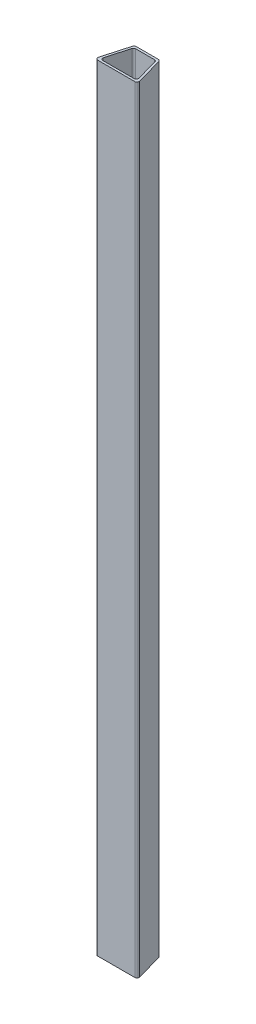
ISO-10303-21;
HEADER;
FILE_DESCRIPTION(('STEP AP214'),'2;1');
FILE_NAME('part.step','',(''),(''),'','','');
FILE_SCHEMA(('AUTOMOTIVE_DESIGN { 1 0 10303 214 1 1 1 1 }'));
ENDSEC;
DATA;
#1=APPLICATION_CONTEXT('core data for automotive mechanical design processes');
#2=APPLICATION_PROTOCOL_DEFINITION('international standard','automotive_design',2000,#1);
#3=PRODUCT_CONTEXT('',#1,'mechanical');
#4=PRODUCT('Part','Part','',(#3));
#5=PRODUCT_RELATED_PRODUCT_CATEGORY('part','',(#4));
#6=PRODUCT_DEFINITION_FORMATION('','',#4);
#7=PRODUCT_DEFINITION_CONTEXT('part definition',#1,'design');
#8=PRODUCT_DEFINITION('design','',#6,#7);
#9=PRODUCT_DEFINITION_SHAPE('','',#8);
#10=(LENGTH_UNIT() NAMED_UNIT(*) SI_UNIT(.MILLI.,.METRE.));
#11=(NAMED_UNIT(*) PLANE_ANGLE_UNIT() SI_UNIT($,.RADIAN.));
#12=(NAMED_UNIT(*) SI_UNIT($,.STERADIAN.) SOLID_ANGLE_UNIT());
#13=UNCERTAINTY_MEASURE_WITH_UNIT(LENGTH_MEASURE(1.E-05),#10,'distance_accuracy_value','');
#14=(GEOMETRIC_REPRESENTATION_CONTEXT(3) GLOBAL_UNCERTAINTY_ASSIGNED_CONTEXT((#13)) GLOBAL_UNIT_ASSIGNED_CONTEXT((#10,
#11,#12)) REPRESENTATION_CONTEXT('',''));
#15=CARTESIAN_POINT('',(0.,0.,0.));
#16=DIRECTION('',(0.,0.,1.));
#17=DIRECTION('',(1.,0.,0.));
#18=AXIS2_PLACEMENT_3D('',#15,#16,#17);
#19=CARTESIAN_POINT('',(-8.35990373267567,350.,6.));
#20=DIRECTION('',(0.,-1.,0.));
#21=DIRECTION('',(0.,0.,-1.));
#22=AXIS2_PLACEMENT_3D('',#19,#20,#21);
#23=PLANE('',#22);
#24=CARTESIAN_POINT('',(-8.35990373267567,350.,6.));
#25=DIRECTION('',(0.,1.,0.));
#26=DIRECTION('',(0.,0.,-1.));
#27=AXIS2_PLACEMENT_3D('',#24,#25,#26);
#28=CIRCLE('',#27,1.);
#29=CARTESIAN_POINT('',(-9.32255467282957,350.,5.72925442308172));
#30=VERTEX_POINT('',#29);
#31=CARTESIAN_POINT('',(-8.35990373267567,350.,7.));
#32=VERTEX_POINT('',#31);
#33=EDGE_CURVE('E214',#30,#32,#28,.T.);
#34=ORIENTED_EDGE('',*,*,#33,.T.);
#35=DIRECTION('',(1.,0.,0.));
#36=VECTOR('',#35,1.);
#37=CARTESIAN_POINT('',(-8.35990373267567,350.,7.));
#38=LINE('',#37,#36);
#39=CARTESIAN_POINT('',(8.35990373267567,350.,7.));
#40=VERTEX_POINT('',#39);
#41=EDGE_CURVE('E216',#32,#40,#38,.T.);
#42=ORIENTED_EDGE('',*,*,#41,.T.);
#43=CARTESIAN_POINT('',(8.35990373267567,350.,6.));
#44=DIRECTION('',(0.,1.,0.));
#45=DIRECTION('',(0.,0.,1.));
#46=AXIS2_PLACEMENT_3D('',#43,#44,#45);
#47=CIRCLE('',#46,1.);
#48=CARTESIAN_POINT('',(9.32255467282956,350.,5.72925442308172));
#49=VERTEX_POINT('',#48);
#50=EDGE_CURVE('E221',#40,#49,#47,.T.);
#51=ORIENTED_EDGE('',*,*,#50,.T.);
#52=DIRECTION('',(-0.270745576918284,0.,-0.962650940153899));
#53=VECTOR('',#52,1.);
#54=CARTESIAN_POINT('',(5.94755467282956,350.,-6.27074557691828));
#55=LINE('',#54,#53);
#56=CARTESIAN_POINT('',(5.94755467282956,350.,-6.27074557691828));
#57=VERTEX_POINT('',#56);
#58=EDGE_CURVE('E223',#49,#57,#55,.T.);
#59=ORIENTED_EDGE('',*,*,#58,.T.);
#60=CARTESIAN_POINT('',(4.98490373267567,350.,-6.));
#61=DIRECTION('',(0.,1.,0.));
#62=DIRECTION('',(0.,0.,-1.));
#63=AXIS2_PLACEMENT_3D('',#60,#61,#62);
#64=CIRCLE('',#63,0.999999999999998);
#65=CARTESIAN_POINT('',(4.98490373267567,350.,-7.));
#66=VERTEX_POINT('',#65);
#67=EDGE_CURVE('E224',#57,#66,#64,.T.);
#68=ORIENTED_EDGE('',*,*,#67,.T.);
#69=DIRECTION('',(-1.,0.,0.));
#70=VECTOR('',#69,1.);
#71=CARTESIAN_POINT('',(-4.98490373267567,350.,-7.));
#72=LINE('',#71,#70);
#73=CARTESIAN_POINT('',(-4.98490373267567,350.,-7.));
#74=VERTEX_POINT('',#73);
#75=EDGE_CURVE('E230',#66,#74,#72,.T.);
#76=ORIENTED_EDGE('',*,*,#75,.T.);
#77=CARTESIAN_POINT('',(-4.98490373267567,350.,-6.));
#78=DIRECTION('',(0.,1.,0.));
#79=DIRECTION('',(0.,0.,1.));
#80=AXIS2_PLACEMENT_3D('',#77,#78,#79);
#81=CIRCLE('',#80,0.999999999999999);
#82=CARTESIAN_POINT('',(-5.94755467282956,350.,-6.27074557691828));
#83=VERTEX_POINT('',#82);
#84=EDGE_CURVE('E227',#74,#83,#81,.T.);
#85=ORIENTED_EDGE('',*,*,#84,.T.);
#86=DIRECTION('',(-0.270745576918284,0.,0.962650940153899));
#87=VECTOR('',#86,1.);
#88=CARTESIAN_POINT('',(-5.94755467282956,350.,-6.27074557691828));
#89=LINE('',#88,#87);
#90=EDGE_CURVE('E231',#83,#30,#89,.T.);
#91=ORIENTED_EDGE('',*,*,#90,.T.);
#92=EDGE_LOOP('',(#34,#42,#51,#59,#68,#76,#85,#91));
#93=FACE_BOUND('',#92,.T.);
#94=CARTESIAN_POINT('',(-7.0398555990135,350.,5.));
#95=DIRECTION('',(0.,1.,0.));
#96=DIRECTION('',(0.,0.,1.));
#97=AXIS2_PLACEMENT_3D('',#94,#95,#96);
#98=CIRCLE('',#97,1.);
#99=CARTESIAN_POINT('',(-8.0025065391674,350.,4.72925442308171));
#100=VERTEX_POINT('',#99);
#101=CARTESIAN_POINT('',(-7.03985559901349,350.,6.));
#102=VERTEX_POINT('',#101);
#103=EDGE_CURVE('E148',#100,#102,#98,.T.);
#104=ORIENTED_EDGE('',*,*,#103,.F.);
#105=DIRECTION('',(-0.270745576918284,0.,0.962650940153899));
#106=VECTOR('',#105,1.);
#107=CARTESIAN_POINT('',(-5.1900065391674,350.,-5.27074557691828));
#108=LINE('',#107,#106);
#109=CARTESIAN_POINT('',(-5.1900065391674,350.,-5.27074557691828));
#110=VERTEX_POINT('',#109);
#111=EDGE_CURVE('E183',#110,#100,#108,.T.);
#112=ORIENTED_EDGE('',*,*,#111,.F.);
#113=CARTESIAN_POINT('',(-4.2273555990135,350.,-5.));
#114=DIRECTION('',(0.,1.,0.));
#115=DIRECTION('',(0.,0.,1.));
#116=AXIS2_PLACEMENT_3D('',#113,#114,#115);
#117=CIRCLE('',#116,1.);
#118=CARTESIAN_POINT('',(-4.22735559901349,350.,-6.));
#119=VERTEX_POINT('',#118);
#120=EDGE_CURVE('E181',#119,#110,#117,.T.);
#121=ORIENTED_EDGE('',*,*,#120,.F.);
#122=DIRECTION('',(-1.,0.,0.));
#123=VECTOR('',#122,1.);
#124=CARTESIAN_POINT('',(-4.22735559901349,350.,-6.));
#125=LINE('',#124,#123);
#126=CARTESIAN_POINT('',(4.22735559901349,350.,-6.));
#127=VERTEX_POINT('',#126);
#128=EDGE_CURVE('E177',#127,#119,#125,.T.);
#129=ORIENTED_EDGE('',*,*,#128,.F.);
#130=CARTESIAN_POINT('',(4.2273555990135,350.,-5.));
#131=DIRECTION('',(0.,1.,0.));
#132=DIRECTION('',(0.,0.,1.));
#133=AXIS2_PLACEMENT_3D('',#130,#131,#132);
#134=CIRCLE('',#133,1.);
#135=CARTESIAN_POINT('',(5.1900065391674,350.,-5.27074557691828));
#136=VERTEX_POINT('',#135);
#137=EDGE_CURVE('E180',#136,#127,#134,.T.);
#138=ORIENTED_EDGE('',*,*,#137,.F.);
#139=DIRECTION('',(-0.270745576918284,0.,-0.962650940153899));
#140=VECTOR('',#139,1.);
#141=CARTESIAN_POINT('',(5.1900065391674,350.,-5.27074557691828));
#142=LINE('',#141,#140);
#143=CARTESIAN_POINT('',(8.0025065391674,350.,4.72925442308171));
#144=VERTEX_POINT('',#143);
#145=EDGE_CURVE('E171',#144,#136,#142,.T.);
#146=ORIENTED_EDGE('',*,*,#145,.F.);
#147=CARTESIAN_POINT('',(7.0398555990135,350.,5.));
#148=DIRECTION('',(0.,1.,0.));
#149=DIRECTION('',(0.,0.,-1.));
#150=AXIS2_PLACEMENT_3D('',#147,#148,#149);
#151=CIRCLE('',#150,1.);
#152=CARTESIAN_POINT('',(7.03985559901349,350.,6.));
#153=VERTEX_POINT('',#152);
#154=EDGE_CURVE('E173',#153,#144,#151,.T.);
#155=ORIENTED_EDGE('',*,*,#154,.F.);
#156=DIRECTION('',(1.,0.,0.));
#157=VECTOR('',#156,1.);
#158=CARTESIAN_POINT('',(-7.03985559901349,350.,6.));
#159=LINE('',#158,#157);
#160=EDGE_CURVE('E156',#102,#153,#159,.T.);
#161=ORIENTED_EDGE('',*,*,#160,.F.);
#162=EDGE_LOOP('',(#104,#112,#121,#129,#138,#146,#155,#161));
#163=FACE_BOUND('',#162,.T.);
#164=ADVANCED_FACE('F40',(#93,#163),#23,.F.);
#165=CARTESIAN_POINT('',(-8.35990373267567,0.,6.));
#166=DIRECTION('',(0.,-1.,0.));
#167=DIRECTION('',(0.,0.,-1.));
#168=AXIS2_PLACEMENT_3D('',#165,#166,#167);
#169=PLANE('',#168);
#170=CARTESIAN_POINT('',(-8.35990373267567,0.,6.));
#171=DIRECTION('',(0.,1.,0.));
#172=DIRECTION('',(0.,0.,-1.));
#173=AXIS2_PLACEMENT_3D('',#170,#171,#172);
#174=CIRCLE('',#173,1.);
#175=CARTESIAN_POINT('',(-9.32255467282957,0.,5.72925442308172));
#176=VERTEX_POINT('',#175);
#177=CARTESIAN_POINT('',(-8.35990373267567,0.,7.));
#178=VERTEX_POINT('',#177);
#179=EDGE_CURVE('E168',#176,#178,#174,.T.);
#180=ORIENTED_EDGE('',*,*,#179,.F.);
#181=DIRECTION('',(-0.270745576918284,0.,0.962650940153899));
#182=VECTOR('',#181,1.);
#183=CARTESIAN_POINT('',(-5.94755467282956,0.,-6.27074557691828));
#184=LINE('',#183,#182);
#185=CARTESIAN_POINT('',(-5.94755467282956,0.,-6.27074557691828));
#186=VERTEX_POINT('',#185);
#187=EDGE_CURVE('E219',#186,#176,#184,.T.);
#188=ORIENTED_EDGE('',*,*,#187,.F.);
#189=CARTESIAN_POINT('',(-4.98490373267567,0.,-6.));
#190=DIRECTION('',(0.,1.,0.));
#191=DIRECTION('',(0.,0.,1.));
#192=AXIS2_PLACEMENT_3D('',#189,#190,#191);
#193=CIRCLE('',#192,0.999999999999999);
#194=CARTESIAN_POINT('',(-4.98490373267567,0.,-7.));
#195=VERTEX_POINT('',#194);
#196=EDGE_CURVE('E247',#195,#186,#193,.T.);
#197=ORIENTED_EDGE('',*,*,#196,.F.);
#198=DIRECTION('',(-1.,0.,0.));
#199=VECTOR('',#198,1.);
#200=CARTESIAN_POINT('',(-4.98490373267567,0.,-7.));
#201=LINE('',#200,#199);
#202=CARTESIAN_POINT('',(4.98490373267567,0.,-7.));
#203=VERTEX_POINT('',#202);
#204=EDGE_CURVE('E242',#203,#195,#201,.T.);
#205=ORIENTED_EDGE('',*,*,#204,.F.);
#206=CARTESIAN_POINT('',(4.98490373267567,0.,-6.));
#207=DIRECTION('',(0.,1.,0.));
#208=DIRECTION('',(0.,0.,-1.));
#209=AXIS2_PLACEMENT_3D('',#206,#207,#208);
#210=CIRCLE('',#209,0.999999999999998);
#211=CARTESIAN_POINT('',(5.94755467282956,0.,-6.27074557691828));
#212=VERTEX_POINT('',#211);
#213=EDGE_CURVE('E245',#212,#203,#210,.T.);
#214=ORIENTED_EDGE('',*,*,#213,.F.);
#215=DIRECTION('',(-0.270745576918284,0.,-0.962650940153899));
#216=VECTOR('',#215,1.);
#217=CARTESIAN_POINT('',(5.94755467282956,0.,-6.27074557691828));
#218=LINE('',#217,#216);
#219=CARTESIAN_POINT('',(9.32255467282956,0.,5.72925442308172));
#220=VERTEX_POINT('',#219);
#221=EDGE_CURVE('E238',#220,#212,#218,.T.);
#222=ORIENTED_EDGE('',*,*,#221,.F.);
#223=CARTESIAN_POINT('',(8.35990373267567,0.,6.));
#224=DIRECTION('',(0.,1.,0.));
#225=DIRECTION('',(0.,0.,1.));
#226=AXIS2_PLACEMENT_3D('',#223,#224,#225);
#227=CIRCLE('',#226,1.);
#228=CARTESIAN_POINT('',(8.35990373267567,0.,7.));
#229=VERTEX_POINT('',#228);
#230=EDGE_CURVE('E239',#229,#220,#227,.T.);
#231=ORIENTED_EDGE('',*,*,#230,.F.);
#232=DIRECTION('',(1.,0.,0.));
#233=VECTOR('',#232,1.);
#234=CARTESIAN_POINT('',(-8.35990373267567,0.,7.));
#235=LINE('',#234,#233);
#236=EDGE_CURVE('E237',#178,#229,#235,.T.);
#237=ORIENTED_EDGE('',*,*,#236,.F.);
#238=EDGE_LOOP('',(#180,#188,#197,#205,#214,#222,#231,#237));
#239=FACE_BOUND('',#238,.T.);
#240=DIRECTION('',(-0.270745576918284,0.,0.962650940153899));
#241=VECTOR('',#240,1.);
#242=CARTESIAN_POINT('',(-5.1900065391674,0.,-5.27074557691828));
#243=LINE('',#242,#241);
#244=CARTESIAN_POINT('',(-5.1900065391674,0.,-5.27074557691828));
#245=VERTEX_POINT('',#244);
#246=CARTESIAN_POINT('',(-8.0025065391674,0.,4.72925442308171));
#247=VERTEX_POINT('',#246);
#248=EDGE_CURVE('E159',#245,#247,#243,.T.);
#249=ORIENTED_EDGE('',*,*,#248,.T.);
#250=CARTESIAN_POINT('',(-7.0398555990135,0.,5.));
#251=DIRECTION('',(0.,1.,0.));
#252=DIRECTION('',(0.,0.,1.));
#253=AXIS2_PLACEMENT_3D('',#250,#251,#252);
#254=CIRCLE('',#253,1.);
#255=CARTESIAN_POINT('',(-7.03985559901349,0.,6.));
#256=VERTEX_POINT('',#255);
#257=EDGE_CURVE('E58',#247,#256,#254,.T.);
#258=ORIENTED_EDGE('',*,*,#257,.T.);
#259=DIRECTION('',(1.,0.,0.));
#260=VECTOR('',#259,1.);
#261=CARTESIAN_POINT('',(-7.03985559901349,0.,6.));
#262=LINE('',#261,#260);
#263=CARTESIAN_POINT('',(7.03985559901349,0.,6.));
#264=VERTEX_POINT('',#263);
#265=EDGE_CURVE('E164',#256,#264,#262,.T.);
#266=ORIENTED_EDGE('',*,*,#265,.T.);
#267=CARTESIAN_POINT('',(7.0398555990135,0.,5.));
#268=DIRECTION('',(0.,1.,0.));
#269=DIRECTION('',(0.,0.,-1.));
#270=AXIS2_PLACEMENT_3D('',#267,#268,#269);
#271=CIRCLE('',#270,1.);
#272=CARTESIAN_POINT('',(8.0025065391674,0.,4.72925442308171));
#273=VERTEX_POINT('',#272);
#274=EDGE_CURVE('E190',#264,#273,#271,.T.);
#275=ORIENTED_EDGE('',*,*,#274,.T.);
#276=DIRECTION('',(-0.270745576918284,0.,-0.962650940153899));
#277=VECTOR('',#276,1.);
#278=CARTESIAN_POINT('',(5.1900065391674,0.,-5.27074557691828));
#279=LINE('',#278,#277);
#280=CARTESIAN_POINT('',(5.1900065391674,0.,-5.27074557691828));
#281=VERTEX_POINT('',#280);
#282=EDGE_CURVE('E189',#273,#281,#279,.T.);
#283=ORIENTED_EDGE('',*,*,#282,.T.);
#284=CARTESIAN_POINT('',(4.2273555990135,0.,-5.));
#285=DIRECTION('',(0.,1.,0.));
#286=DIRECTION('',(0.,0.,1.));
#287=AXIS2_PLACEMENT_3D('',#284,#285,#286);
#288=CIRCLE('',#287,1.);
#289=CARTESIAN_POINT('',(4.22735559901349,0.,-6.));
#290=VERTEX_POINT('',#289);
#291=EDGE_CURVE('E194',#281,#290,#288,.T.);
#292=ORIENTED_EDGE('',*,*,#291,.T.);
#293=DIRECTION('',(-1.,0.,0.));
#294=VECTOR('',#293,1.);
#295=CARTESIAN_POINT('',(-4.22735559901349,0.,-6.));
#296=LINE('',#295,#294);
#297=CARTESIAN_POINT('',(-4.22735559901349,0.,-6.));
#298=VERTEX_POINT('',#297);
#299=EDGE_CURVE('E198',#290,#298,#296,.T.);
#300=ORIENTED_EDGE('',*,*,#299,.T.);
#301=CARTESIAN_POINT('',(-4.2273555990135,0.,-5.));
#302=DIRECTION('',(0.,1.,0.));
#303=DIRECTION('',(0.,0.,1.));
#304=AXIS2_PLACEMENT_3D('',#301,#302,#303);
#305=CIRCLE('',#304,1.);
#306=EDGE_CURVE('E197',#298,#245,#305,.T.);
#307=ORIENTED_EDGE('',*,*,#306,.T.);
#308=EDGE_LOOP('',(#249,#258,#266,#275,#283,#292,#300,#307));
#309=FACE_BOUND('',#308,.T.);
#310=ADVANCED_FACE('F276',(#239,#309),#169,.T.);
#311=CARTESIAN_POINT('',(-8.35990373267567,350.,6.));
#312=DIRECTION('',(0.,-1.,0.));
#313=DIRECTION('',(0.,0.,-1.));
#314=AXIS2_PLACEMENT_3D('',#311,#312,#313);
#315=CYLINDRICAL_SURFACE('',#314,1.);
#316=ORIENTED_EDGE('',*,*,#179,.T.);
#317=DIRECTION('',(0.,-1.,0.));
#318=VECTOR('',#317,1.);
#319=CARTESIAN_POINT('',(-8.35990373267567,350.,7.));
#320=LINE('',#319,#318);
#321=EDGE_CURVE('E11',#32,#178,#320,.T.);
#322=ORIENTED_EDGE('',*,*,#321,.F.);
#323=ORIENTED_EDGE('',*,*,#33,.F.);
#324=DIRECTION('',(0.,-1.,0.));
#325=VECTOR('',#324,1.);
#326=CARTESIAN_POINT('',(-9.32255467282957,350.,5.72925442308172));
#327=LINE('',#326,#325);
#328=EDGE_CURVE('E232',#30,#176,#327,.T.);
#329=ORIENTED_EDGE('',*,*,#328,.T.);
#330=EDGE_LOOP('',(#316,#322,#323,#329));
#331=FACE_BOUND('',#330,.T.);
#332=ADVANCED_FACE('F39',(#331),#315,.T.);
#333=CARTESIAN_POINT('',(-8.35990373267567,350.,7.));
#334=DIRECTION('',(0.,0.,-1.));
#335=DIRECTION('',(-1.,0.,0.));
#336=AXIS2_PLACEMENT_3D('',#333,#334,#335);
#337=PLANE('',#336);
#338=ORIENTED_EDGE('',*,*,#236,.T.);
#339=DIRECTION('',(0.,-1.,0.));
#340=VECTOR('',#339,1.);
#341=CARTESIAN_POINT('',(8.35990373267567,350.,7.));
#342=LINE('',#341,#340);
#343=EDGE_CURVE('E44',#40,#229,#342,.T.);
#344=ORIENTED_EDGE('',*,*,#343,.F.);
#345=ORIENTED_EDGE('',*,*,#41,.F.);
#346=ORIENTED_EDGE('',*,*,#321,.T.);
#347=EDGE_LOOP('',(#338,#344,#345,#346));
#348=FACE_BOUND('',#347,.T.);
#349=ADVANCED_FACE('F291',(#348),#337,.F.);
#350=CARTESIAN_POINT('',(8.35990373267567,350.,6.));
#351=DIRECTION('',(0.,-1.,0.));
#352=DIRECTION('',(0.,0.,-1.));
#353=AXIS2_PLACEMENT_3D('',#350,#351,#352);
#354=CYLINDRICAL_SURFACE('',#353,1.);
#355=ORIENTED_EDGE('',*,*,#230,.T.);
#356=DIRECTION('',(0.,-1.,0.));
#357=VECTOR('',#356,1.);
#358=CARTESIAN_POINT('',(9.32255467282956,350.,5.72925442308172));
#359=LINE('',#358,#357);
#360=EDGE_CURVE('E261',#49,#220,#359,.T.);
#361=ORIENTED_EDGE('',*,*,#360,.F.);
#362=ORIENTED_EDGE('',*,*,#50,.F.);
#363=ORIENTED_EDGE('',*,*,#343,.T.);
#364=EDGE_LOOP('',(#355,#361,#362,#363));
#365=FACE_BOUND('',#364,.T.);
#366=ADVANCED_FACE('F269',(#365),#354,.T.);
#367=CARTESIAN_POINT('',(5.94755467282956,350.,-6.27074557691828));
#368=DIRECTION('',(-0.962650940153899,0.,0.270745576918284));
#369=DIRECTION('',(0.270745576918284,0.,0.962650940153899));
#370=AXIS2_PLACEMENT_3D('',#367,#368,#369);
#371=PLANE('',#370);
#372=ORIENTED_EDGE('',*,*,#221,.T.);
#373=DIRECTION('',(0.,-1.,0.));
#374=VECTOR('',#373,1.);
#375=CARTESIAN_POINT('',(5.94755467282956,350.,-6.27074557691828));
#376=LINE('',#375,#374);
#377=EDGE_CURVE('E259',#57,#212,#376,.T.);
#378=ORIENTED_EDGE('',*,*,#377,.F.);
#379=ORIENTED_EDGE('',*,*,#58,.F.);
#380=ORIENTED_EDGE('',*,*,#360,.T.);
#381=EDGE_LOOP('',(#372,#378,#379,#380));
#382=FACE_BOUND('',#381,.T.);
#383=ADVANCED_FACE('F285',(#382),#371,.F.);
#384=CARTESIAN_POINT('',(4.98490373267567,350.,-6.));
#385=DIRECTION('',(0.,-1.,0.));
#386=DIRECTION('',(0.,0.,-1.));
#387=AXIS2_PLACEMENT_3D('',#384,#385,#386);
#388=CYLINDRICAL_SURFACE('',#387,0.999999999999998);
#389=ORIENTED_EDGE('',*,*,#213,.T.);
#390=DIRECTION('',(0.,-1.,0.));
#391=VECTOR('',#390,1.);
#392=CARTESIAN_POINT('',(4.98490373267567,350.,-7.));
#393=LINE('',#392,#391);
#394=EDGE_CURVE('E257',#66,#203,#393,.T.);
#395=ORIENTED_EDGE('',*,*,#394,.F.);
#396=ORIENTED_EDGE('',*,*,#67,.F.);
#397=ORIENTED_EDGE('',*,*,#377,.T.);
#398=EDGE_LOOP('',(#389,#395,#396,#397));
#399=FACE_BOUND('',#398,.T.);
#400=ADVANCED_FACE('F288',(#399),#388,.T.);
#401=CARTESIAN_POINT('',(-4.98490373267567,350.,-7.));
#402=DIRECTION('',(0.,0.,1.));
#403=DIRECTION('',(1.,0.,0.));
#404=AXIS2_PLACEMENT_3D('',#401,#402,#403);
#405=PLANE('',#404);
#406=ORIENTED_EDGE('',*,*,#204,.T.);
#407=DIRECTION('',(0.,-1.,0.));
#408=VECTOR('',#407,1.);
#409=CARTESIAN_POINT('',(-4.98490373267567,350.,-7.));
#410=LINE('',#409,#408);
#411=EDGE_CURVE('E252',#74,#195,#410,.T.);
#412=ORIENTED_EDGE('',*,*,#411,.F.);
#413=ORIENTED_EDGE('',*,*,#75,.F.);
#414=ORIENTED_EDGE('',*,*,#394,.T.);
#415=EDGE_LOOP('',(#406,#412,#413,#414));
#416=FACE_BOUND('',#415,.T.);
#417=ADVANCED_FACE('F308',(#416),#405,.F.);
#418=CARTESIAN_POINT('',(-4.98490373267567,350.,-6.));
#419=DIRECTION('',(0.,-1.,0.));
#420=DIRECTION('',(0.,0.,-1.));
#421=AXIS2_PLACEMENT_3D('',#418,#419,#420);
#422=CYLINDRICAL_SURFACE('',#421,0.999999999999999);
#423=ORIENTED_EDGE('',*,*,#196,.T.);
#424=DIRECTION('',(0.,-1.,0.));
#425=VECTOR('',#424,1.);
#426=CARTESIAN_POINT('',(-5.94755467282956,350.,-6.27074557691828));
#427=LINE('',#426,#425);
#428=EDGE_CURVE('E253',#83,#186,#427,.T.);
#429=ORIENTED_EDGE('',*,*,#428,.F.);
#430=ORIENTED_EDGE('',*,*,#84,.F.);
#431=ORIENTED_EDGE('',*,*,#411,.T.);
#432=EDGE_LOOP('',(#423,#429,#430,#431));
#433=FACE_BOUND('',#432,.T.);
#434=ADVANCED_FACE('F305',(#433),#422,.T.);
#435=CARTESIAN_POINT('',(-5.94755467282956,350.,-6.27074557691828));
#436=DIRECTION('',(0.962650940153899,0.,0.270745576918284));
#437=DIRECTION('',(0.270745576918284,0.,-0.962650940153899));
#438=AXIS2_PLACEMENT_3D('',#435,#436,#437);
#439=PLANE('',#438);
#440=ORIENTED_EDGE('',*,*,#187,.T.);
#441=ORIENTED_EDGE('',*,*,#328,.F.);
#442=ORIENTED_EDGE('',*,*,#90,.F.);
#443=ORIENTED_EDGE('',*,*,#428,.T.);
#444=EDGE_LOOP('',(#440,#441,#442,#443));
#445=FACE_BOUND('',#444,.T.);
#446=ADVANCED_FACE('F297',(#445),#439,.F.);
#447=CARTESIAN_POINT('',(-7.0398555990135,350.,5.));
#448=DIRECTION('',(0.,-1.,0.));
#449=DIRECTION('',(0.,0.,-1.));
#450=AXIS2_PLACEMENT_3D('',#447,#448,#449);
#451=CYLINDRICAL_SURFACE('',#450,1.);
#452=ORIENTED_EDGE('',*,*,#257,.F.);
#453=DIRECTION('',(0.,-1.,0.));
#454=VECTOR('',#453,1.);
#455=CARTESIAN_POINT('',(-8.0025065391674,350.,4.72925442308171));
#456=LINE('',#455,#454);
#457=EDGE_CURVE('E152',#100,#247,#456,.T.);
#458=ORIENTED_EDGE('',*,*,#457,.F.);
#459=ORIENTED_EDGE('',*,*,#103,.T.);
#460=DIRECTION('',(0.,-1.,0.));
#461=VECTOR('',#460,1.);
#462=CARTESIAN_POINT('',(-7.03985559901349,350.,6.));
#463=LINE('',#462,#461);
#464=EDGE_CURVE('E151',#102,#256,#463,.T.);
#465=ORIENTED_EDGE('',*,*,#464,.T.);
#466=EDGE_LOOP('',(#452,#458,#459,#465));
#467=FACE_BOUND('',#466,.T.);
#468=ADVANCED_FACE('F155',(#467),#451,.F.);
#469=CARTESIAN_POINT('',(-7.03985559901349,350.,6.));
#470=DIRECTION('',(0.,0.,-1.));
#471=DIRECTION('',(-1.,0.,0.));
#472=AXIS2_PLACEMENT_3D('',#469,#470,#471);
#473=PLANE('',#472);
#474=ORIENTED_EDGE('',*,*,#265,.F.);
#475=ORIENTED_EDGE('',*,*,#464,.F.);
#476=ORIENTED_EDGE('',*,*,#160,.T.);
#477=DIRECTION('',(0.,-1.,0.));
#478=VECTOR('',#477,1.);
#479=CARTESIAN_POINT('',(7.03985559901349,350.,6.));
#480=LINE('',#479,#478);
#481=EDGE_CURVE('E167',#153,#264,#480,.T.);
#482=ORIENTED_EDGE('',*,*,#481,.T.);
#483=EDGE_LOOP('',(#474,#475,#476,#482));
#484=FACE_BOUND('',#483,.T.);
#485=ADVANCED_FACE('F165',(#484),#473,.T.);
#486=CARTESIAN_POINT('',(7.0398555990135,350.,5.));
#487=DIRECTION('',(0.,-1.,0.));
#488=DIRECTION('',(0.,0.,-1.));
#489=AXIS2_PLACEMENT_3D('',#486,#487,#488);
#490=CYLINDRICAL_SURFACE('',#489,1.);
#491=ORIENTED_EDGE('',*,*,#274,.F.);
#492=ORIENTED_EDGE('',*,*,#481,.F.);
#493=ORIENTED_EDGE('',*,*,#154,.T.);
#494=DIRECTION('',(0.,-1.,0.));
#495=VECTOR('',#494,1.);
#496=CARTESIAN_POINT('',(8.0025065391674,350.,4.72925442308171));
#497=LINE('',#496,#495);
#498=EDGE_CURVE('E212',#144,#273,#497,.T.);
#499=ORIENTED_EDGE('',*,*,#498,.T.);
#500=EDGE_LOOP('',(#491,#492,#493,#499));
#501=FACE_BOUND('',#500,.T.);
#502=ADVANCED_FACE('F333',(#501),#490,.F.);
#503=CARTESIAN_POINT('',(5.1900065391674,350.,-5.27074557691828));
#504=DIRECTION('',(-0.962650940153899,0.,0.270745576918284));
#505=DIRECTION('',(0.270745576918284,0.,0.962650940153899));
#506=AXIS2_PLACEMENT_3D('',#503,#504,#505);
#507=PLANE('',#506);
#508=ORIENTED_EDGE('',*,*,#282,.F.);
#509=ORIENTED_EDGE('',*,*,#498,.F.);
#510=ORIENTED_EDGE('',*,*,#145,.T.);
#511=DIRECTION('',(0.,-1.,0.));
#512=VECTOR('',#511,1.);
#513=CARTESIAN_POINT('',(5.1900065391674,350.,-5.27074557691828));
#514=LINE('',#513,#512);
#515=EDGE_CURVE('E209',#136,#281,#514,.T.);
#516=ORIENTED_EDGE('',*,*,#515,.T.);
#517=EDGE_LOOP('',(#508,#509,#510,#516));
#518=FACE_BOUND('',#517,.T.);
#519=ADVANCED_FACE('F334',(#518),#507,.T.);
#520=CARTESIAN_POINT('',(4.2273555990135,350.,-5.));
#521=DIRECTION('',(0.,-1.,0.));
#522=DIRECTION('',(0.,0.,-1.));
#523=AXIS2_PLACEMENT_3D('',#520,#521,#522);
#524=CYLINDRICAL_SURFACE('',#523,1.);
#525=ORIENTED_EDGE('',*,*,#291,.F.);
#526=ORIENTED_EDGE('',*,*,#515,.F.);
#527=ORIENTED_EDGE('',*,*,#137,.T.);
#528=DIRECTION('',(0.,-1.,0.));
#529=VECTOR('',#528,1.);
#530=CARTESIAN_POINT('',(4.22735559901349,350.,-6.));
#531=LINE('',#530,#529);
#532=EDGE_CURVE('E206',#127,#290,#531,.T.);
#533=ORIENTED_EDGE('',*,*,#532,.T.);
#534=EDGE_LOOP('',(#525,#526,#527,#533));
#535=FACE_BOUND('',#534,.T.);
#536=ADVANCED_FACE('F343',(#535),#524,.F.);
#537=CARTESIAN_POINT('',(-4.22735559901349,350.,-6.));
#538=DIRECTION('',(0.,0.,1.));
#539=DIRECTION('',(1.,0.,0.));
#540=AXIS2_PLACEMENT_3D('',#537,#538,#539);
#541=PLANE('',#540);
#542=ORIENTED_EDGE('',*,*,#299,.F.);
#543=ORIENTED_EDGE('',*,*,#532,.F.);
#544=ORIENTED_EDGE('',*,*,#128,.T.);
#545=DIRECTION('',(0.,-1.,0.));
#546=VECTOR('',#545,1.);
#547=CARTESIAN_POINT('',(-4.22735559901349,350.,-6.));
#548=LINE('',#547,#546);
#549=EDGE_CURVE('E208',#119,#298,#548,.T.);
#550=ORIENTED_EDGE('',*,*,#549,.T.);
#551=EDGE_LOOP('',(#542,#543,#544,#550));
#552=FACE_BOUND('',#551,.T.);
#553=ADVANCED_FACE('F344',(#552),#541,.T.);
#554=CARTESIAN_POINT('',(-4.2273555990135,350.,-5.));
#555=DIRECTION('',(0.,-1.,0.));
#556=DIRECTION('',(0.,0.,-1.));
#557=AXIS2_PLACEMENT_3D('',#554,#555,#556);
#558=CYLINDRICAL_SURFACE('',#557,1.);
#559=ORIENTED_EDGE('',*,*,#306,.F.);
#560=ORIENTED_EDGE('',*,*,#549,.F.);
#561=ORIENTED_EDGE('',*,*,#120,.T.);
#562=DIRECTION('',(0.,-1.,0.));
#563=VECTOR('',#562,1.);
#564=CARTESIAN_POINT('',(-5.1900065391674,350.,-5.27074557691828));
#565=LINE('',#564,#563);
#566=EDGE_CURVE('E55',#110,#245,#565,.T.);
#567=ORIENTED_EDGE('',*,*,#566,.T.);
#568=EDGE_LOOP('',(#559,#560,#561,#567));
#569=FACE_BOUND('',#568,.T.);
#570=ADVANCED_FACE('F350',(#569),#558,.F.);
#571=CARTESIAN_POINT('',(-5.1900065391674,350.,-5.27074557691828));
#572=DIRECTION('',(0.962650940153899,0.,0.270745576918284));
#573=DIRECTION('',(0.270745576918284,0.,-0.962650940153899));
#574=AXIS2_PLACEMENT_3D('',#571,#572,#573);
#575=PLANE('',#574);
#576=ORIENTED_EDGE('',*,*,#248,.F.);
#577=ORIENTED_EDGE('',*,*,#566,.F.);
#578=ORIENTED_EDGE('',*,*,#111,.T.);
#579=ORIENTED_EDGE('',*,*,#457,.T.);
#580=EDGE_LOOP('',(#576,#577,#578,#579));
#581=FACE_BOUND('',#580,.T.);
#582=ADVANCED_FACE('F351',(#581),#575,.T.);
#583=CLOSED_SHELL('',(#164,#310,#332,#349,#366,#383,#400,#417,#434,#446,#468,#485,#502,#519,
#536,#553,#570,#582));
#584=MANIFOLD_SOLID_BREP('B2',#583);
#585=ADVANCED_BREP_SHAPE_REPRESENTATION('',(#18,#584),#14);
#586=SHAPE_DEFINITION_REPRESENTATION(#9,#585);
ENDSEC;
END-ISO-10303-21;
